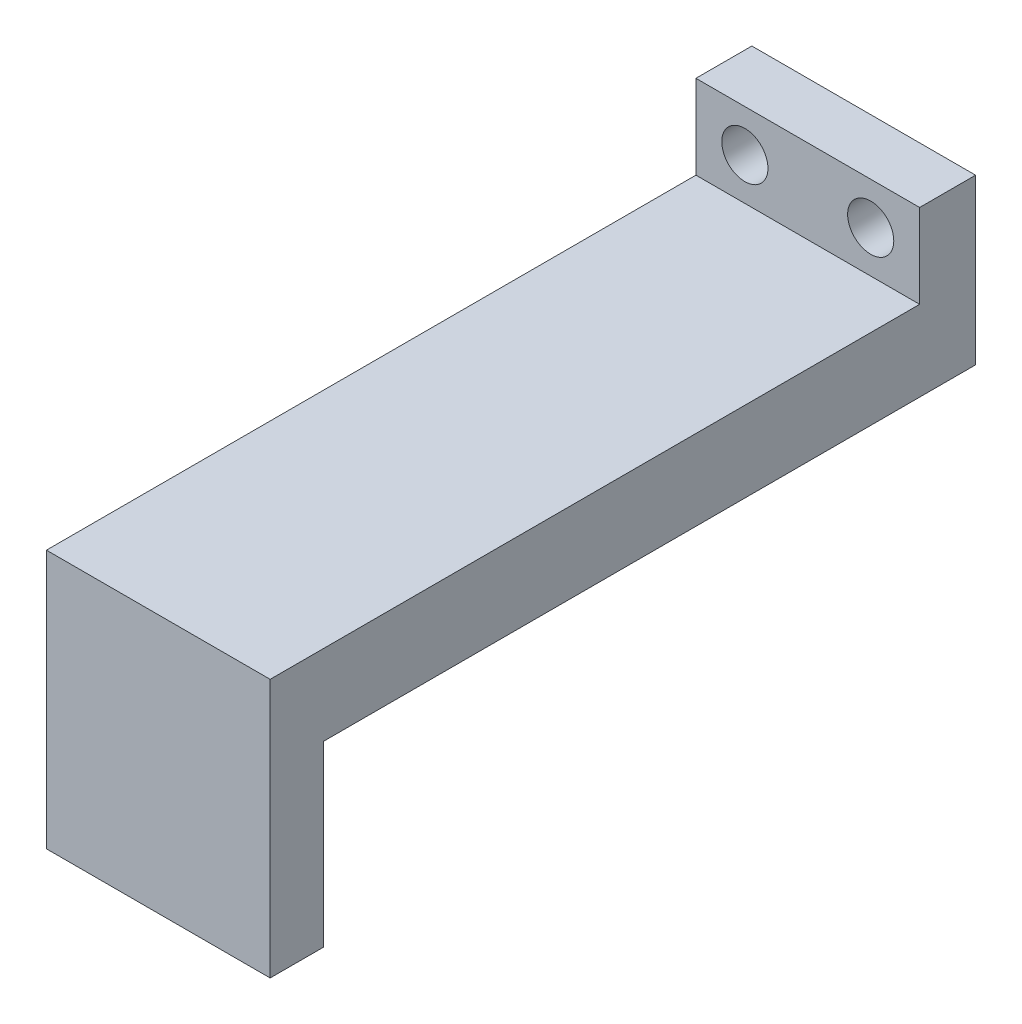
ISO-10303-21;
HEADER;
FILE_DESCRIPTION(('STEP AP214'),'2;1');
FILE_NAME('part.step','',(''),(''),'','','');
FILE_SCHEMA(('AUTOMOTIVE_DESIGN { 1 0 10303 214 1 1 1 1 }'));
ENDSEC;
DATA;
#1=APPLICATION_CONTEXT('core data for automotive mechanical design processes');
#2=APPLICATION_PROTOCOL_DEFINITION('international standard','automotive_design',2000,#1);
#3=PRODUCT_CONTEXT('',#1,'mechanical');
#4=PRODUCT('Part','Part','',(#3));
#5=PRODUCT_RELATED_PRODUCT_CATEGORY('part','',(#4));
#6=PRODUCT_DEFINITION_FORMATION('','',#4);
#7=PRODUCT_DEFINITION_CONTEXT('part definition',#1,'design');
#8=PRODUCT_DEFINITION('design','',#6,#7);
#9=PRODUCT_DEFINITION_SHAPE('','',#8);
#10=(LENGTH_UNIT() NAMED_UNIT(*) SI_UNIT(.MILLI.,.METRE.));
#11=(NAMED_UNIT(*) PLANE_ANGLE_UNIT() SI_UNIT($,.RADIAN.));
#12=(NAMED_UNIT(*) SI_UNIT($,.STERADIAN.) SOLID_ANGLE_UNIT());
#13=UNCERTAINTY_MEASURE_WITH_UNIT(LENGTH_MEASURE(1.E-05),#10,'distance_accuracy_value','');
#14=(GEOMETRIC_REPRESENTATION_CONTEXT(3) GLOBAL_UNCERTAINTY_ASSIGNED_CONTEXT((#13)) GLOBAL_UNIT_ASSIGNED_CONTEXT((#10,
#11,#12)) REPRESENTATION_CONTEXT('',''));
#15=CARTESIAN_POINT('',(0.,0.,0.));
#16=DIRECTION('',(0.,0.,1.));
#17=DIRECTION('',(1.,0.,0.));
#18=AXIS2_PLACEMENT_3D('',#15,#16,#17);
#19=CARTESIAN_POINT('',(-8.,27.25,4.));
#20=DIRECTION('',(0.,1.,0.));
#21=DIRECTION('',(0.,0.,1.));
#22=AXIS2_PLACEMENT_3D('',#19,#20,#21);
#23=PLANE('',#22);
#24=DIRECTION('',(1.,0.,0.));
#25=VECTOR('',#24,1.);
#26=CARTESIAN_POINT('',(-8.,27.25,46.65));
#27=LINE('',#26,#25);
#28=CARTESIAN_POINT('',(-8.,27.25,46.65));
#29=VERTEX_POINT('',#28);
#30=CARTESIAN_POINT('',(8.,27.25,46.65));
#31=VERTEX_POINT('',#30);
#32=EDGE_CURVE('E53',#29,#31,#27,.T.);
#33=ORIENTED_EDGE('',*,*,#32,.F.);
#34=DIRECTION('',(0.,0.,-1.));
#35=VECTOR('',#34,1.);
#36=CARTESIAN_POINT('',(-8.,27.25,4.));
#37=LINE('',#36,#35);
#38=CARTESIAN_POINT('',(-8.,27.25,0.));
#39=VERTEX_POINT('',#38);
#40=EDGE_CURVE('E188',#29,#39,#37,.T.);
#41=ORIENTED_EDGE('',*,*,#40,.T.);
#42=DIRECTION('',(1.,0.,0.));
#43=VECTOR('',#42,1.);
#44=CARTESIAN_POINT('',(-8.,27.25,0.));
#45=LINE('',#44,#43);
#46=CARTESIAN_POINT('',(8.,27.25,0.));
#47=VERTEX_POINT('',#46);
#48=EDGE_CURVE('E168',#39,#47,#45,.T.);
#49=ORIENTED_EDGE('',*,*,#48,.T.);
#50=DIRECTION('',(0.,0.,-1.));
#51=VECTOR('',#50,1.);
#52=CARTESIAN_POINT('',(8.,27.25,4.));
#53=LINE('',#52,#51);
#54=EDGE_CURVE('E186',#31,#47,#53,.T.);
#55=ORIENTED_EDGE('',*,*,#54,.F.);
#56=EDGE_LOOP('',(#33,#41,#49,#55));
#57=FACE_BOUND('',#56,.T.);
#58=ADVANCED_FACE('F44',(#57),#23,.F.);
#59=CARTESIAN_POINT('',(-8.,39.,4.));
#60=DIRECTION('',(1.,0.,0.));
#61=DIRECTION('',(0.,0.,-1.));
#62=AXIS2_PLACEMENT_3D('',#59,#60,#61);
#63=PLANE('',#62);
#64=ORIENTED_EDGE('',*,*,#40,.F.);
#65=DIRECTION('',(0.,-1.,0.));
#66=VECTOR('',#65,1.);
#67=CARTESIAN_POINT('',(-8.,27.7,46.65));
#68=LINE('',#67,#66);
#69=CARTESIAN_POINT('',(-8.,14.5,46.65));
#70=VERTEX_POINT('',#69);
#71=EDGE_CURVE('E133',#29,#70,#68,.T.);
#72=ORIENTED_EDGE('',*,*,#71,.T.);
#73=DIRECTION('',(0.,0.,-1.));
#74=VECTOR('',#73,1.);
#75=CARTESIAN_POINT('',(-8.,14.5,50.45));
#76=LINE('',#75,#74);
#77=CARTESIAN_POINT('',(-8.,14.5,50.45));
#78=VERTEX_POINT('',#77);
#79=EDGE_CURVE('E130',#78,#70,#76,.T.);
#80=ORIENTED_EDGE('',*,*,#79,.F.);
#81=DIRECTION('',(0.,-1.,0.));
#82=VECTOR('',#81,1.);
#83=CARTESIAN_POINT('',(-8.,33.,50.45));
#84=LINE('',#83,#82);
#85=CARTESIAN_POINT('',(-8.,33.,50.45));
#86=VERTEX_POINT('',#85);
#87=EDGE_CURVE('E109',#86,#78,#84,.T.);
#88=ORIENTED_EDGE('',*,*,#87,.F.);
#89=DIRECTION('',(0.,0.,-1.));
#90=VECTOR('',#89,1.);
#91=CARTESIAN_POINT('',(-8.,33.,50.45));
#92=LINE('',#91,#90);
#93=CARTESIAN_POINT('',(-8.,33.,4.));
#94=VERTEX_POINT('',#93);
#95=EDGE_CURVE('E150',#86,#94,#92,.T.);
#96=ORIENTED_EDGE('',*,*,#95,.T.);
#97=DIRECTION('',(0.,-1.,0.));
#98=VECTOR('',#97,1.);
#99=CARTESIAN_POINT('',(-8.,39.,4.));
#100=LINE('',#99,#98);
#101=CARTESIAN_POINT('',(-8.,39.,4.));
#102=VERTEX_POINT('',#101);
#103=EDGE_CURVE('E156',#102,#94,#100,.T.);
#104=ORIENTED_EDGE('',*,*,#103,.F.);
#105=DIRECTION('',(0.,0.,-1.));
#106=VECTOR('',#105,1.);
#107=CARTESIAN_POINT('',(-8.,39.,4.));
#108=LINE('',#107,#106);
#109=CARTESIAN_POINT('',(-8.,39.,0.));
#110=VERTEX_POINT('',#109);
#111=EDGE_CURVE('E167',#102,#110,#108,.T.);
#112=ORIENTED_EDGE('',*,*,#111,.T.);
#113=DIRECTION('',(0.,-1.,0.));
#114=VECTOR('',#113,1.);
#115=CARTESIAN_POINT('',(-8.,39.,0.));
#116=LINE('',#115,#114);
#117=EDGE_CURVE('E154',#110,#39,#116,.T.);
#118=ORIENTED_EDGE('',*,*,#117,.T.);
#119=EDGE_LOOP('',(#64,#72,#80,#88,#96,#104,#112,#118));
#120=FACE_BOUND('',#119,.T.);
#121=ADVANCED_FACE('F50',(#120),#63,.F.);
#122=CARTESIAN_POINT('',(8.,27.25,4.));
#123=DIRECTION('',(-1.,0.,0.));
#124=DIRECTION('',(0.,0.,1.));
#125=AXIS2_PLACEMENT_3D('',#122,#123,#124);
#126=PLANE('',#125);
#127=DIRECTION('',(0.,1.,0.));
#128=VECTOR('',#127,1.);
#129=CARTESIAN_POINT('',(8.,27.25,50.45));
#130=LINE('',#129,#128);
#131=CARTESIAN_POINT('',(8.,14.5,50.45));
#132=VERTEX_POINT('',#131);
#133=CARTESIAN_POINT('',(8.,33.,50.45));
#134=VERTEX_POINT('',#133);
#135=EDGE_CURVE('E125',#132,#134,#130,.T.);
#136=ORIENTED_EDGE('',*,*,#135,.F.);
#137=DIRECTION('',(0.,0.,-1.));
#138=VECTOR('',#137,1.);
#139=CARTESIAN_POINT('',(8.,14.5,50.45));
#140=LINE('',#139,#138);
#141=CARTESIAN_POINT('',(8.,14.5,46.65));
#142=VERTEX_POINT('',#141);
#143=EDGE_CURVE('E129',#132,#142,#140,.T.);
#144=ORIENTED_EDGE('',*,*,#143,.T.);
#145=DIRECTION('',(0.,1.,0.));
#146=VECTOR('',#145,1.);
#147=CARTESIAN_POINT('',(8.,14.5,46.65));
#148=LINE('',#147,#146);
#149=EDGE_CURVE('E131',#142,#31,#148,.T.);
#150=ORIENTED_EDGE('',*,*,#149,.T.);
#151=ORIENTED_EDGE('',*,*,#54,.T.);
#152=DIRECTION('',(0.,1.,0.));
#153=VECTOR('',#152,1.);
#154=CARTESIAN_POINT('',(8.,27.25,0.));
#155=LINE('',#154,#153);
#156=CARTESIAN_POINT('',(8.,39.,0.));
#157=VERTEX_POINT('',#156);
#158=EDGE_CURVE('E173',#47,#157,#155,.T.);
#159=ORIENTED_EDGE('',*,*,#158,.T.);
#160=DIRECTION('',(0.,0.,-1.));
#161=VECTOR('',#160,1.);
#162=CARTESIAN_POINT('',(8.,39.,4.));
#163=LINE('',#162,#161);
#164=CARTESIAN_POINT('',(8.,39.,4.));
#165=VERTEX_POINT('',#164);
#166=EDGE_CURVE('E185',#165,#157,#163,.T.);
#167=ORIENTED_EDGE('',*,*,#166,.F.);
#168=DIRECTION('',(0.,1.,0.));
#169=VECTOR('',#168,1.);
#170=CARTESIAN_POINT('',(8.,27.25,4.));
#171=LINE('',#170,#169);
#172=CARTESIAN_POINT('',(8.,33.,4.));
#173=VERTEX_POINT('',#172);
#174=EDGE_CURVE('E157',#173,#165,#171,.T.);
#175=ORIENTED_EDGE('',*,*,#174,.F.);
#176=DIRECTION('',(0.,0.,-1.));
#177=VECTOR('',#176,1.);
#178=CARTESIAN_POINT('',(8.,33.,50.45));
#179=LINE('',#178,#177);
#180=EDGE_CURVE('E151',#134,#173,#179,.T.);
#181=ORIENTED_EDGE('',*,*,#180,.F.);
#182=EDGE_LOOP('',(#136,#144,#150,#151,#159,#167,#175,#181));
#183=FACE_BOUND('',#182,.T.);
#184=ADVANCED_FACE('F224',(#183),#126,.F.);
#185=CARTESIAN_POINT('',(8.,39.,4.));
#186=DIRECTION('',(0.,-1.,0.));
#187=DIRECTION('',(0.,0.,-1.));
#188=AXIS2_PLACEMENT_3D('',#185,#186,#187);
#189=PLANE('',#188);
#190=DIRECTION('',(-1.,0.,0.));
#191=VECTOR('',#190,1.);
#192=CARTESIAN_POINT('',(8.,39.,0.));
#193=LINE('',#192,#191);
#194=EDGE_CURVE('E159',#157,#110,#193,.T.);
#195=ORIENTED_EDGE('',*,*,#194,.T.);
#196=ORIENTED_EDGE('',*,*,#111,.F.);
#197=DIRECTION('',(-1.,0.,0.));
#198=VECTOR('',#197,1.);
#199=CARTESIAN_POINT('',(8.,39.,4.));
#200=LINE('',#199,#198);
#201=EDGE_CURVE('E162',#165,#102,#200,.T.);
#202=ORIENTED_EDGE('',*,*,#201,.F.);
#203=ORIENTED_EDGE('',*,*,#166,.T.);
#204=EDGE_LOOP('',(#195,#196,#202,#203));
#205=FACE_BOUND('',#204,.T.);
#206=ADVANCED_FACE('F247',(#205),#189,.F.);
#207=CARTESIAN_POINT('',(0.,0.,4.));
#208=DIRECTION('',(0.,0.,1.));
#209=DIRECTION('',(1.,0.,0.));
#210=AXIS2_PLACEMENT_3D('',#207,#208,#209);
#211=PLANE('',#210);
#212=CARTESIAN_POINT('',(-4.5,36.,4.));
#213=DIRECTION('',(0.,0.,1.));
#214=DIRECTION('',(1.,0.,0.));
#215=AXIS2_PLACEMENT_3D('',#212,#213,#214);
#216=CIRCLE('',#215,1.65);
#217=CARTESIAN_POINT('',(-2.85,36.,4.));
#218=VERTEX_POINT('',#217);
#219=EDGE_CURVE('E205',#218,#218,#216,.F.);
#220=ORIENTED_EDGE('',*,*,#219,.T.);
#221=EDGE_LOOP('',(#220));
#222=FACE_BOUND('',#221,.T.);
#223=CARTESIAN_POINT('',(4.5,36.,4.));
#224=DIRECTION('',(0.,0.,1.));
#225=DIRECTION('',(1.,0.,0.));
#226=AXIS2_PLACEMENT_3D('',#223,#224,#225);
#227=CIRCLE('',#226,1.65);
#228=CARTESIAN_POINT('',(6.15,36.,4.));
#229=VERTEX_POINT('',#228);
#230=EDGE_CURVE('E197',#229,#229,#227,.F.);
#231=ORIENTED_EDGE('',*,*,#230,.T.);
#232=EDGE_LOOP('',(#231));
#233=FACE_BOUND('',#232,.T.);
#234=DIRECTION('',(-1.,0.,0.));
#235=VECTOR('',#234,1.);
#236=CARTESIAN_POINT('',(8.,33.,4.));
#237=LINE('',#236,#235);
#238=EDGE_CURVE('E68',#173,#94,#237,.T.);
#239=ORIENTED_EDGE('',*,*,#238,.F.);
#240=ORIENTED_EDGE('',*,*,#174,.T.);
#241=ORIENTED_EDGE('',*,*,#201,.T.);
#242=ORIENTED_EDGE('',*,*,#103,.T.);
#243=EDGE_LOOP('',(#239,#240,#241,#242));
#244=FACE_BOUND('',#243,.T.);
#245=ADVANCED_FACE('F252',(#222,#233,#244),#211,.T.);
#246=CARTESIAN_POINT('',(0.,0.,0.));
#247=DIRECTION('',(0.,0.,1.));
#248=DIRECTION('',(1.,0.,0.));
#249=AXIS2_PLACEMENT_3D('',#246,#247,#248);
#250=PLANE('',#249);
#251=CARTESIAN_POINT('',(-4.5,36.,0.));
#252=DIRECTION('',(0.,0.,1.));
#253=DIRECTION('',(1.,0.,0.));
#254=AXIS2_PLACEMENT_3D('',#251,#252,#253);
#255=CIRCLE('',#254,1.65);
#256=CARTESIAN_POINT('',(-2.85,36.,0.));
#257=VERTEX_POINT('',#256);
#258=EDGE_CURVE('E200',#257,#257,#255,.F.);
#259=ORIENTED_EDGE('',*,*,#258,.F.);
#260=EDGE_LOOP('',(#259));
#261=FACE_BOUND('',#260,.T.);
#262=CARTESIAN_POINT('',(4.5,36.,0.));
#263=DIRECTION('',(0.,0.,1.));
#264=DIRECTION('',(1.,0.,0.));
#265=AXIS2_PLACEMENT_3D('',#262,#263,#264);
#266=CIRCLE('',#265,1.65);
#267=CARTESIAN_POINT('',(6.15,36.,0.));
#268=VERTEX_POINT('',#267);
#269=EDGE_CURVE('E192',#268,#268,#266,.F.);
#270=ORIENTED_EDGE('',*,*,#269,.F.);
#271=EDGE_LOOP('',(#270));
#272=FACE_BOUND('',#271,.T.);
#273=ORIENTED_EDGE('',*,*,#117,.F.);
#274=ORIENTED_EDGE('',*,*,#194,.F.);
#275=ORIENTED_EDGE('',*,*,#158,.F.);
#276=ORIENTED_EDGE('',*,*,#48,.F.);
#277=EDGE_LOOP('',(#273,#274,#275,#276));
#278=FACE_BOUND('',#277,.T.);
#279=ADVANCED_FACE('F255',(#261,#272,#278),#250,.F.);
#280=CARTESIAN_POINT('',(8.,33.,50.45));
#281=DIRECTION('',(0.,-1.,0.));
#282=DIRECTION('',(0.,0.,-1.));
#283=AXIS2_PLACEMENT_3D('',#280,#281,#282);
#284=PLANE('',#283);
#285=ORIENTED_EDGE('',*,*,#238,.T.);
#286=ORIENTED_EDGE('',*,*,#95,.F.);
#287=DIRECTION('',(-1.,0.,0.));
#288=VECTOR('',#287,1.);
#289=CARTESIAN_POINT('',(8.,33.,50.45));
#290=LINE('',#289,#288);
#291=EDGE_CURVE('E116',#134,#86,#290,.T.);
#292=ORIENTED_EDGE('',*,*,#291,.F.);
#293=ORIENTED_EDGE('',*,*,#180,.T.);
#294=EDGE_LOOP('',(#285,#286,#292,#293));
#295=FACE_BOUND('',#294,.T.);
#296=ADVANCED_FACE('F240',(#295),#284,.F.);
#297=CARTESIAN_POINT('',(0.,0.,50.45));
#298=DIRECTION('',(0.,0.,1.));
#299=DIRECTION('',(1.,0.,0.));
#300=AXIS2_PLACEMENT_3D('',#297,#298,#299);
#301=PLANE('',#300);
#302=ORIENTED_EDGE('',*,*,#87,.T.);
#303=DIRECTION('',(1.,0.,0.));
#304=VECTOR('',#303,1.);
#305=CARTESIAN_POINT('',(-8.,14.5,50.45));
#306=LINE('',#305,#304);
#307=EDGE_CURVE('E114',#78,#132,#306,.T.);
#308=ORIENTED_EDGE('',*,*,#307,.T.);
#309=ORIENTED_EDGE('',*,*,#135,.T.);
#310=ORIENTED_EDGE('',*,*,#291,.T.);
#311=EDGE_LOOP('',(#302,#308,#309,#310));
#312=FACE_BOUND('',#311,.T.);
#313=ADVANCED_FACE('F115',(#312),#301,.T.);
#314=CARTESIAN_POINT('',(0.,0.,46.65));
#315=DIRECTION('',(0.,0.,1.));
#316=DIRECTION('',(1.,0.,0.));
#317=AXIS2_PLACEMENT_3D('',#314,#315,#316);
#318=PLANE('',#317);
#319=CARTESIAN_POINT('',(0.,17.,46.65));
#320=DIRECTION('',(0.,0.,1.));
#321=DIRECTION('',(1.,0.,0.));
#322=AXIS2_PLACEMENT_3D('',#319,#320,#321);
#323=CIRCLE('',#322,2.);
#324=CARTESIAN_POINT('',(2.,17.,46.65));
#325=VERTEX_POINT('',#324);
#326=EDGE_CURVE('E11',#325,#325,#323,.F.);
#327=ORIENTED_EDGE('',*,*,#326,.F.);
#328=EDGE_LOOP('',(#327));
#329=FACE_BOUND('',#328,.T.);
#330=ORIENTED_EDGE('',*,*,#71,.F.);
#331=ORIENTED_EDGE('',*,*,#32,.T.);
#332=ORIENTED_EDGE('',*,*,#149,.F.);
#333=DIRECTION('',(1.,0.,0.));
#334=VECTOR('',#333,1.);
#335=CARTESIAN_POINT('',(-8.,14.5,46.65));
#336=LINE('',#335,#334);
#337=EDGE_CURVE('E220',#70,#142,#336,.T.);
#338=ORIENTED_EDGE('',*,*,#337,.F.);
#339=EDGE_LOOP('',(#330,#331,#332,#338));
#340=FACE_BOUND('',#339,.T.);
#341=ADVANCED_FACE('F223',(#329,#340),#318,.F.);
#342=CARTESIAN_POINT('',(-8.,14.5,50.45));
#343=DIRECTION('',(0.,1.,0.));
#344=DIRECTION('',(0.,0.,1.));
#345=AXIS2_PLACEMENT_3D('',#342,#343,#344);
#346=PLANE('',#345);
#347=ORIENTED_EDGE('',*,*,#337,.T.);
#348=ORIENTED_EDGE('',*,*,#143,.F.);
#349=ORIENTED_EDGE('',*,*,#307,.F.);
#350=ORIENTED_EDGE('',*,*,#79,.T.);
#351=EDGE_LOOP('',(#347,#348,#349,#350));
#352=FACE_BOUND('',#351,.T.);
#353=ADVANCED_FACE('F127',(#352),#346,.F.);
#354=CARTESIAN_POINT('',(4.5,36.,4.1));
#355=DIRECTION('',(0.,0.,-1.));
#356=DIRECTION('',(-1.,0.,0.));
#357=AXIS2_PLACEMENT_3D('',#354,#355,#356);
#358=CYLINDRICAL_SURFACE('',#357,1.65);
#359=ORIENTED_EDGE('',*,*,#230,.F.);
#360=EDGE_LOOP('',(#359));
#361=FACE_BOUND('',#360,.T.);
#362=ORIENTED_EDGE('',*,*,#269,.T.);
#363=EDGE_LOOP('',(#362));
#364=FACE_BOUND('',#363,.T.);
#365=ADVANCED_FACE('F232',(#361,#364),#358,.F.);
#366=CARTESIAN_POINT('',(-4.5,36.,4.1));
#367=DIRECTION('',(0.,0.,-1.));
#368=DIRECTION('',(-1.,0.,0.));
#369=AXIS2_PLACEMENT_3D('',#366,#367,#368);
#370=CYLINDRICAL_SURFACE('',#369,1.65);
#371=ORIENTED_EDGE('',*,*,#219,.F.);
#372=EDGE_LOOP('',(#371));
#373=FACE_BOUND('',#372,.T.);
#374=ORIENTED_EDGE('',*,*,#258,.T.);
#375=EDGE_LOOP('',(#374));
#376=FACE_BOUND('',#375,.T.);
#377=ADVANCED_FACE('F345',(#373,#376),#370,.F.);
#378=CARTESIAN_POINT('',(0.,17.,46.85));
#379=DIRECTION('',(0.,0.,-1.));
#380=DIRECTION('',(-1.,0.,0.));
#381=AXIS2_PLACEMENT_3D('',#378,#379,#380);
#382=CYLINDRICAL_SURFACE('',#381,2.);
#383=CARTESIAN_POINT('',(0.,17.,43.35));
#384=DIRECTION('',(0.,0.,1.));
#385=DIRECTION('',(1.,0.,0.));
#386=AXIS2_PLACEMENT_3D('',#383,#384,#385);
#387=CIRCLE('',#386,2.);
#388=CARTESIAN_POINT('',(2.,17.,43.35));
#389=VERTEX_POINT('',#388);
#390=EDGE_CURVE('E196',#389,#389,#387,.T.);
#391=ORIENTED_EDGE('',*,*,#390,.T.);
#392=EDGE_LOOP('',(#391));
#393=FACE_BOUND('',#392,.T.);
#394=ORIENTED_EDGE('',*,*,#326,.T.);
#395=EDGE_LOOP('',(#394));
#396=FACE_BOUND('',#395,.T.);
#397=ADVANCED_FACE('F348',(#393,#396),#382,.T.);
#398=CARTESIAN_POINT('',(0.,17.,43.35));
#399=DIRECTION('',(0.,0.,1.));
#400=DIRECTION('',(1.,0.,0.));
#401=AXIS2_PLACEMENT_3D('',#398,#399,#400);
#402=PLANE('',#401);
#403=ORIENTED_EDGE('',*,*,#390,.F.);
#404=EDGE_LOOP('',(#403));
#405=FACE_BOUND('',#404,.T.);
#406=ADVANCED_FACE('F357',(#405),#402,.F.);
#407=CLOSED_SHELL('',(#58,#121,#184,#206,#245,#279,#296,#313,#341,#353,#365,#377,#397,#406));
#408=MANIFOLD_SOLID_BREP('B2',#407);
#409=ADVANCED_BREP_SHAPE_REPRESENTATION('',(#18,#408),#14);
#410=SHAPE_DEFINITION_REPRESENTATION(#9,#409);
ENDSEC;
END-ISO-10303-21;
